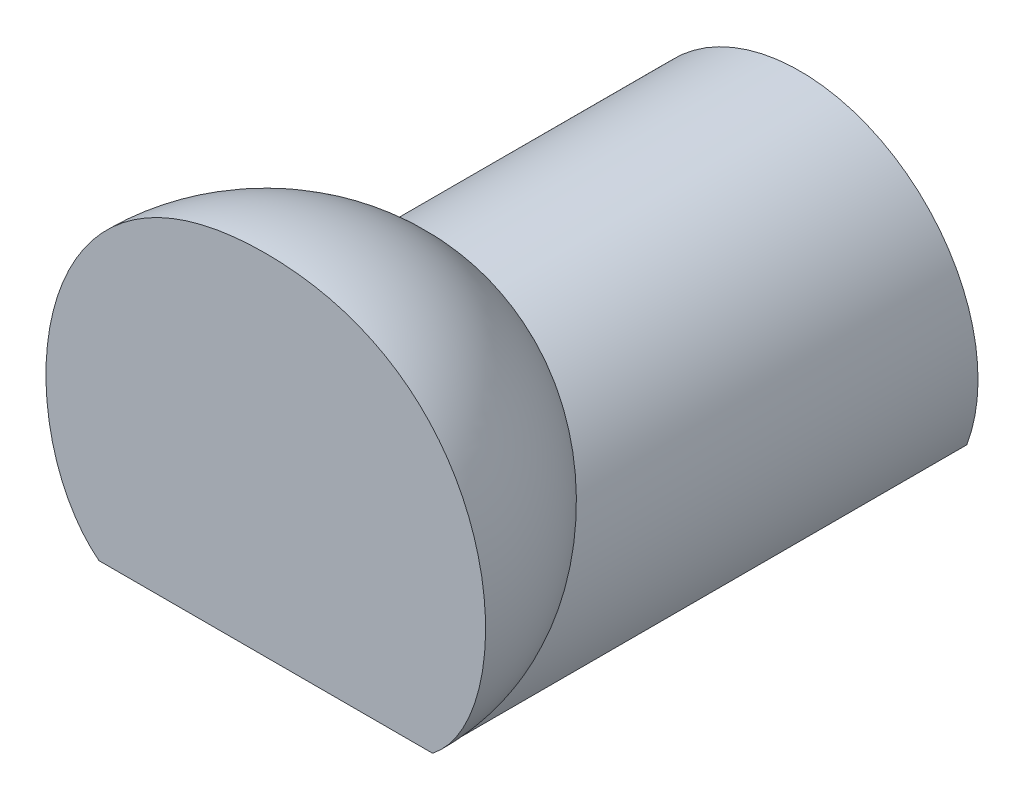
ISO-10303-21;
HEADER;
FILE_DESCRIPTION(('STEP AP214'),'2;1');
FILE_NAME('part.step','',(''),(''),'','','');
FILE_SCHEMA(('AUTOMOTIVE_DESIGN { 1 0 10303 214 1 1 1 1 }'));
ENDSEC;
DATA;
#1=APPLICATION_CONTEXT('core data for automotive mechanical design processes');
#2=APPLICATION_PROTOCOL_DEFINITION('international standard','automotive_design',2000,#1);
#3=PRODUCT_CONTEXT('',#1,'mechanical');
#4=PRODUCT('Part','Part','',(#3));
#5=PRODUCT_RELATED_PRODUCT_CATEGORY('part','',(#4));
#6=PRODUCT_DEFINITION_FORMATION('','',#4);
#7=PRODUCT_DEFINITION_CONTEXT('part definition',#1,'design');
#8=PRODUCT_DEFINITION('design','',#6,#7);
#9=PRODUCT_DEFINITION_SHAPE('','',#8);
#10=(LENGTH_UNIT() NAMED_UNIT(*) SI_UNIT(.MILLI.,.METRE.));
#11=(NAMED_UNIT(*) PLANE_ANGLE_UNIT() SI_UNIT($,.RADIAN.));
#12=(NAMED_UNIT(*) SI_UNIT($,.STERADIAN.) SOLID_ANGLE_UNIT());
#13=UNCERTAINTY_MEASURE_WITH_UNIT(LENGTH_MEASURE(1.E-05),#10,'distance_accuracy_value','');
#14=(GEOMETRIC_REPRESENTATION_CONTEXT(3) GLOBAL_UNCERTAINTY_ASSIGNED_CONTEXT((#13)) GLOBAL_UNIT_ASSIGNED_CONTEXT((#10,
#11,#12)) REPRESENTATION_CONTEXT('',''));
#15=CARTESIAN_POINT('',(0.,0.,0.));
#16=DIRECTION('',(0.,0.,1.));
#17=DIRECTION('',(1.,0.,0.));
#18=AXIS2_PLACEMENT_3D('',#15,#16,#17);
#19=CARTESIAN_POINT('',(18.7349939951952,7.,45.));
#20=DIRECTION('',(0.,0.,-1.));
#21=DIRECTION('',(-1.,0.,0.));
#22=AXIS2_PLACEMENT_3D('',#19,#20,#21);
#23=CYLINDRICAL_SURFACE('',#22,20.);
#24=DIRECTION('',(0.,0.,-1.));
#25=VECTOR('',#24,1.);
#26=CARTESIAN_POINT('',(0.,0.,45.));
#27=LINE('',#26,#25);
#28=CARTESIAN_POINT('',(0.,0.,60.));
#29=VERTEX_POINT('',#28);
#30=CARTESIAN_POINT('',(0.,0.,0.));
#31=VERTEX_POINT('',#30);
#32=EDGE_CURVE('E11',#29,#31,#27,.T.);
#33=ORIENTED_EDGE('',*,*,#32,.F.);
#34=CARTESIAN_POINT('',(0.,0.,60.));
#35=CARTESIAN_POINT('',(-1.49588586913227E-06,2.4836416856962E-05,59.7771956089762));
#36=CARTESIAN_POINT('',(-0.00163058694526144,0.0043651027708911,59.5543833675001));
#37=CARTESIAN_POINT('',(-0.0081644600845192,0.0218786428731389,59.1086065100618));
#38=CARTESIAN_POINT('',(-0.0130772916976982,0.0350736227683761,58.8856428679733));
#39=CARTESIAN_POINT('',(-0.0262080014116734,0.070523990218114,58.4402311770362));
#40=CARTESIAN_POINT('',(-0.0344302631593904,0.092791395522377,58.2177842071907));
#41=CARTESIAN_POINT('',(-0.0541964937516618,0.146741378775225,57.7740883447886));
#42=CARTESIAN_POINT('',(-0.0657417597322178,0.178427633533923,57.5528399545249));
#43=CARTESIAN_POINT('',(-0.0920470270505949,0.251369164046482,57.1138055400158));
#44=CARTESIAN_POINT('',(-0.106782512335607,0.292551612857774,56.8960060047371));
#45=CARTESIAN_POINT('',(-0.139458123780874,0.385057528453657,56.4629421834637));
#46=CARTESIAN_POINT('',(-0.157396315549423,0.436374875870754,56.2476764502809));
#47=CARTESIAN_POINT('',(-0.196353776567661,0.549600478886838,55.8203597749052));
#48=CARTESIAN_POINT('',(-0.217371210156514,0.611502428224116,55.6083069998702));
#49=CARTESIAN_POINT('',(-0.262278514648397,0.746306413373693,55.1880750214285));
#50=CARTESIAN_POINT('',(-0.286167765899213,0.819206077071063,54.9798949935536));
#51=CARTESIAN_POINT('',(-0.333934107764347,0.968295166078048,54.5890687933806));
#52=CARTESIAN_POINT('',(-0.357565768607208,1.04339758973547,54.4059775644469));
#53=CARTESIAN_POINT('',(-0.406563231231058,1.20278184087857,54.0440153128466));
#54=CARTESIAN_POINT('',(-0.43192943844138,1.28706581719086,53.8651452900685));
#55=CARTESIAN_POINT('',(-0.48398591385509,1.46471545423644,53.5121688104094));
#56=CARTESIAN_POINT('',(-0.510676198222776,1.55808122585341,53.338062411723));
#57=CARTESIAN_POINT('',(-0.56490132064884,1.75363642509622,52.9950627389094));
#58=CARTESIAN_POINT('',(-0.592435987906084,1.85582407573154,52.8261684241735));
#59=CARTESIAN_POINT('',(-0.647779227491819,2.06845422175168,52.4941752024019));
#60=CARTESIAN_POINT('',(-0.675587174481598,2.17888053813165,52.3310658187776));
#61=CARTESIAN_POINT('',(-0.730984866062051,2.40766737663284,52.0104664480797));
#62=CARTESIAN_POINT('',(-0.758574599108373,2.5260283154283,51.852976756782));
#63=CARTESIAN_POINT('',(-0.812991412219296,2.77011844999004,51.5436401958467));
#64=CARTESIAN_POINT('',(-0.839818360407673,2.89584890849122,51.3917943005754));
#65=CARTESIAN_POINT('',(-0.892175085296673,3.15401577922707,51.0937063015866));
#66=CARTESIAN_POINT('',(-0.917704886566853,3.28645206435023,50.9474640917413));
#67=CARTESIAN_POINT('',(-0.982949604641426,3.64527928619712,50.5672823608682));
#68=CARTESIAN_POINT('',(-1.02112447655065,3.87689325276355,50.3379869698994));
#69=CARTESIAN_POINT('',(-1.09063338094304,4.35375707411201,49.8929352270546));
#70=CARTESIAN_POINT('',(-1.12196586818991,4.59900999336232,49.6771819412558));
#71=CARTESIAN_POINT('',(-1.17620063876674,5.10053795172373,49.2577431913126));
#72=CARTESIAN_POINT('',(-1.19910187587586,5.35681435431823,49.0540592274612));
#73=CARTESIAN_POINT('',(-1.23530689551196,5.87928971390253,48.6563457211234));
#74=CARTESIAN_POINT('',(-1.24856506972174,6.1455296414584,48.4623660471849));
#75=CARTESIAN_POINT('',(-1.26434021557792,6.68475017710492,48.0836830527569));
#76=CARTESIAN_POINT('',(-1.26685902005899,6.95772962699591,47.8989781547056));
#77=CARTESIAN_POINT('',(-1.26043219644868,7.50880659836465,47.5375168575702));
#78=CARTESIAN_POINT('',(-1.25148509405475,7.7869047734832,47.3607614836723));
#79=CARTESIAN_POINT('',(-1.22148774682848,8.34848353536577,47.0130619780293));
#80=CARTESIAN_POINT('',(-1.20036182610214,8.63198695923915,46.8421613259128));
#81=CARTESIAN_POINT('',(-1.14554042897611,9.20140370247291,46.5064360875355));
#82=CARTESIAN_POINT('',(-1.11184358982335,9.48731727982087,46.3416121621531));
#83=CARTESIAN_POINT('',(-1.03158190781987,10.0604274717449,46.0173320969477));
#84=CARTESIAN_POINT('',(-0.985015420683025,10.347624245652,45.8578766459483));
#85=CARTESIAN_POINT('',(-0.878805520256431,10.9222777452244,45.5438007642434));
#86=CARTESIAN_POINT('',(-0.819160859484604,11.2097344930809,45.3891807963867));
#87=CARTESIAN_POINT('',(-0.686731170459327,11.7836395556042,45.084564065848));
#88=CARTESIAN_POINT('',(-0.613961240409154,12.0700886473849,44.9345622205753));
#89=CARTESIAN_POINT('',(-0.455155351044135,12.6414667037071,44.6387263725461));
#90=CARTESIAN_POINT('',(-0.369118167976433,12.9263955255102,44.4928927557335));
#91=CARTESIAN_POINT('',(-0.091053485007462,13.7776099054765,44.0614135333787));
#92=CARTESIAN_POINT('',(0.120972612100965,14.3405218994061,43.7816850603958));
#93=CARTESIAN_POINT('',(0.598509670671693,15.4518918372759,43.2373863022232));
#94=CARTESIAN_POINT('',(0.864099241223009,16.000327181863,42.9728390384379));
#95=CARTESIAN_POINT('',(1.44798079428062,17.076399692304,42.4598725217441));
#96=CARTESIAN_POINT('',(1.76627452527343,17.604036167426,42.2114538042888));
#97=CARTESIAN_POINT('',(2.45436220569042,18.6328845012869,41.7319813170179));
#98=CARTESIAN_POINT('',(2.82414879478703,19.1341001225008,41.5009250726855));
#99=CARTESIAN_POINT('',(3.6135202696168,20.1046633593275,41.0576820375329));
#100=CARTESIAN_POINT('',(4.03310068442616,20.5740138301311,40.8454935555885));
#101=CARTESIAN_POINT('',(4.88873998633362,21.4439307172462,40.4557247316786));
#102=CARTESIAN_POINT('',(5.32161496773537,21.847011100077,40.2767632349505));
#103=CARTESIAN_POINT('',(6.22582398368043,22.6164334084946,39.9379262067828));
#104=CARTESIAN_POINT('',(6.69715664470536,22.98277664511,39.7780499942131));
#105=CARTESIAN_POINT('',(7.67481864358307,23.6742564306214,39.4786569097011));
#106=CARTESIAN_POINT('',(8.18112907696582,23.9994149735141,39.3391291649204));
#107=CARTESIAN_POINT('',(9.22510176283355,24.6047126562686,39.0813273889217));
#108=CARTESIAN_POINT('',(9.76276125741669,24.8848557481995,38.9630514918195));
#109=CARTESIAN_POINT('',(10.8135296625026,25.372642639015,38.7584990513495));
#110=CARTESIAN_POINT('',(11.3242561767412,25.584610054586,38.6702675053617));
#111=CARTESIAN_POINT('',(12.3640419172193,25.9662224742215,38.5122674456236));
#112=CARTESIAN_POINT('',(12.8930999372077,26.1358702570048,38.4424977196467));
#113=CARTESIAN_POINT('',(13.9653637203266,26.430897190416,38.3216740342182));
#114=CARTESIAN_POINT('',(14.5085659292036,26.5562873493173,38.2706154205991));
#115=CARTESIAN_POINT('',(15.6049433783411,26.7614214012023,38.1873195532683));
#116=CARTESIAN_POINT('',(16.1581183469297,26.8411665356879,38.1550817876468));
#117=CARTESIAN_POINT('',(17.2394610003394,26.9509987886085,38.1107353346303));
#118=CARTESIAN_POINT('',(17.7673369856665,26.9835687127975,38.0976199696033));
#119=CARTESIAN_POINT('',(18.8241449449622,27.0067829623924,38.0882687489883));
#120=CARTESIAN_POINT('',(19.353076870685,26.9974291613601,38.0920321390926));
#121=CARTESIAN_POINT('',(20.4080714692925,26.9368992323341,38.1164313089231));
#122=CARTESIAN_POINT('',(20.9341345382521,26.8857290326297,38.1370646969985));
#123=CARTESIAN_POINT('',(21.9796530064015,26.7421026821257,38.1951725898335));
#124=CARTESIAN_POINT('',(22.4991083851378,26.6496464035614,38.2326471467101));
#125=CARTESIAN_POINT('',(23.5214903661001,26.4257562873375,38.3238149618088));
#126=CARTESIAN_POINT('',(24.0245406372475,26.294804768815,38.3773076696024));
#127=CARTESIAN_POINT('',(25.0171058418551,25.9948376925695,38.5005294052069));
#128=CARTESIAN_POINT('',(25.5066209836118,25.8258227209838,38.5702581829998));
#129=CARTESIAN_POINT('',(26.4688771456133,25.4513844653394,38.725727139777));
#130=CARTESIAN_POINT('',(26.9416183831949,25.2459616532181,38.8114671112166));
#131=CARTESIAN_POINT('',(27.8673545346471,24.8006692807009,38.9986213659949));
#132=CARTESIAN_POINT('',(28.3203490824409,24.5607990820509,39.1000359397613));
#133=CARTESIAN_POINT('',(29.2129207567741,24.0436056954238,39.320302525665));
#134=CARTESIAN_POINT('',(29.6520351824387,23.7656178857221,39.4394682516103));
#135=CARTESIAN_POINT('',(30.5043838914937,23.1786660599343,39.6930109910996));
#136=CARTESIAN_POINT('',(30.9176179617617,22.8697017888142,39.8273881298826));
#137=CARTESIAN_POINT('',(31.7161305529493,22.2234671761465,40.1106351996335));
#138=CARTESIAN_POINT('',(32.1014043781745,21.8861921004484,40.259507555169));
#139=CARTESIAN_POINT('',(32.8421454518807,21.1861899802146,40.5709013117398));
#140=CARTESIAN_POINT('',(33.1976116986799,20.8234620810902,40.7334231710987));
#141=CARTESIAN_POINT('',(33.8974469855357,20.053220780794,41.0812684224622));
#142=CARTESIAN_POINT('',(34.2399092859191,19.644327172322,41.2673723514584));
#143=CARTESIAN_POINT('',(34.8884329333807,18.8045707071139,41.6529137295126));
#144=CARTESIAN_POINT('',(35.1944929785826,18.373707065437,41.8523516550442));
#145=CARTESIAN_POINT('',(35.7692786697992,17.4933104788149,42.2636895821026));
#146=CARTESIAN_POINT('',(36.0379968635685,17.0437738305163,42.4755920591819));
#147=CARTESIAN_POINT('',(36.5373436631041,16.1294946259526,42.9111144333635));
#148=CARTESIAN_POINT('',(36.7679712000462,15.6647516434358,43.1347346590341));
#149=CARTESIAN_POINT('',(37.2094112945778,14.6818756816132,43.6135705752202));
#150=CARTESIAN_POINT('',(37.4166690870463,14.1626552009385,43.8698316973332));
#151=CARTESIAN_POINT('',(37.7853941754178,13.1147879126686,44.3959084577075));
#152=CARTESIAN_POINT('',(37.9468567581003,12.5861401407681,44.6657254877748));
#153=CARTESIAN_POINT('',(38.1549070861842,11.7898286452901,45.0814511038455));
#154=CARTESIAN_POINT('',(38.2185928455235,11.523683949431,45.221941913817));
#155=CARTESIAN_POINT('',(38.3346358781269,10.991026485616,45.5068357362875));
#156=CARTESIAN_POINT('',(38.3869940452112,10.7245137483722,45.6512384391003));
#157=CARTESIAN_POINT('',(38.4804995483676,10.1918835975176,45.9442852466584));
#158=CARTESIAN_POINT('',(38.5216476870189,9.92576615696298,46.0929290469212));
#159=CARTESIAN_POINT('',(38.5929128545227,9.3947476563674,46.3949116443904));
#160=CARTESIAN_POINT('',(38.6230307114629,9.12984650648957,46.5482500882141));
#161=CARTESIAN_POINT('',(38.67579268848,8.5667904690666,46.8811122073973));
#162=CARTESIAN_POINT('',(38.6968946880232,8.26893576593516,47.0613915087187));
#163=CARTESIAN_POINT('',(38.7257091777583,7.67746725354671,47.4297865842732));
#164=CARTESIAN_POINT('',(38.7334222651811,7.38385325570664,47.6179020085821));
#165=CARTESIAN_POINT('',(38.7361314196595,6.80254484724997,48.0033310293957));
#166=CARTESIAN_POINT('',(38.7311243663283,6.51485190658411,48.200646871206));
#167=CARTESIAN_POINT('',(38.7093236355508,5.94816177627246,48.6055412961968));
#168=CARTESIAN_POINT('',(38.6925557781677,5.66914693322583,48.8130964733232));
#169=CARTESIAN_POINT('',(38.6484880348933,5.121661955098,49.2405539896344));
#170=CARTESIAN_POINT('',(38.6211903281111,4.85318965093891,49.4604537661149));
#171=CARTESIAN_POINT('',(38.5576792371779,4.32968214616587,49.914383597373));
#172=CARTESIAN_POINT('',(38.5214697010538,4.07464120359019,50.1484075206729));
#173=CARTESIAN_POINT('',(38.4551668949897,3.66186713238764,50.5531590214252));
#174=CARTESIAN_POINT('',(38.4269448025525,3.49958303855771,50.7195638963224));
#175=CARTESIAN_POINT('',(38.3681520274668,3.18359970559999,51.0599315445946));
#176=CARTESIAN_POINT('',(38.3375816011015,3.02989953282656,51.2338934923374));
#177=CARTESIAN_POINT('',(38.2749155243256,2.73214085252088,51.5896191913966));
#178=CARTESIAN_POINT('',(38.2428199535417,2.588081842573,51.7713825353588));
#179=CARTESIAN_POINT('',(38.1780605141856,2.31093055648939,52.142314789076));
#180=CARTESIAN_POINT('',(38.1453981897804,2.17781285568955,52.3314649314476));
#181=CARTESIAN_POINT('',(38.0803170264205,1.92301509812355,52.7173898292261));
#182=CARTESIAN_POINT('',(38.0478982075125,1.80133597374893,52.9141652043447));
#183=CARTESIAN_POINT('',(37.9841626532783,1.57009234723161,53.3148641715499));
#184=CARTESIAN_POINT('',(37.952845789891,1.46052643419125,53.5187869274868));
#185=CARTESIAN_POINT('',(37.8996201060585,1.27954003032062,53.8816765376593));
#186=CARTESIAN_POINT('',(37.8773058470729,1.20540256587046,54.0392353171779));
#187=CARTESIAN_POINT('',(37.8339999417238,1.06422604013583,54.3576841880912));
#188=CARTESIAN_POINT('',(37.8130083921636,0.997187498146855,54.5185745221657));
#189=CARTESIAN_POINT('',(37.7523768301285,0.806696390388244,55.005703850501));
#190=CARTESIAN_POINT('',(37.7150731306037,0.693845798165489,55.3364465790425));
#191=CARTESIAN_POINT('',(37.6478720271702,0.495073172617866,56.0077095917765));
#192=CARTESIAN_POINT('',(37.6179989577775,0.409239379063229,56.3482580298408));
#193=CARTESIAN_POINT('',(37.5663624672729,0.263118802890487,57.0353270170418));
#194=CARTESIAN_POINT('',(37.5445978113487,0.202828130175027,57.3818466484224));
#195=CARTESIAN_POINT('',(37.5174066332155,0.128194733800274,57.9185678172831));
#196=CARTESIAN_POINT('',(37.5090663340194,0.105464070201562,58.1075130618162));
#197=CARTESIAN_POINT('',(37.4947888354114,0.0667083859631935,58.4861438699941));
#198=CARTESIAN_POINT('',(37.4888510654715,0.0506817732835771,58.6758292470647));
#199=CARTESIAN_POINT('',(37.4793989902357,0.0252260838941812,59.0544629199815));
#200=CARTESIAN_POINT('',(37.4758692465961,0.015754972714439,59.2434080391536));
#201=CARTESIAN_POINT('',(37.4711640532883,0.00314797240771398,59.6215693758854));
#202=CARTESIAN_POINT('',(37.4699889768744,1.30876783628889E-05,59.8107856316685));
#203=CARTESIAN_POINT('',(37.4699879903904,0.,60.));
#204=B_SPLINE_CURVE_WITH_KNOTS('',3,(#34,#35,#36,#37,#38,#39,#40,#41,#42,#43,#44,#45,#46,#47,
#48,#49,#50,#51,#52,#53,#54,#55,#56,#57,#58,#59,#60,#61,#62,#63,#64,#65,#66,#67,#68,#69,#70,#71,
#72,#73,#74,#75,#76,#77,#78,#79,#80,#81,#82,#83,#84,#85,#86,#87,#88,#89,#90,#91,#92,#93,#94,#95,
#96,#97,#98,#99,#100,#101,#102,#103,#104,#105,#106,#107,#108,#109,#110,#111,#112,#113,#114,#115,
#116,#117,#118,#119,#120,#121,#122,#123,#124,#125,#126,#127,#128,#129,#130,#131,#132,#133,#134,
#135,#136,#137,#138,#139,#140,#141,#142,#143,#144,#145,#146,#147,#148,#149,#150,#151,#152,#153,
#154,#155,#156,#157,#158,#159,#160,#161,#162,#163,#164,#165,#166,#167,#168,#169,#170,#171,#172,
#173,#174,#175,#176,#177,#178,#179,#180,#181,#182,#183,#184,#185,#186,#187,#188,#189,#190,#191,
#192,#193,#194,#195,#196,#197,#198,#199,#200,#201,#202,#203),.UNSPECIFIED.,.F.,.F.,(4,2,2,2,2,2,
2,2,2,2,2,2,2,2,2,2,2,2,2,2,2,2,2,2,2,2,2,2,2,2,2,2,2,2,2,2,2,2,2,2,2,2,2,2,2,2,2,2,2,2,2,2,2,2,
2,2,2,2,2,2,2,2,2,2,2,2,2,2,2,2,2,2,2,2,2,2,2,2,2,2,2,2,2,2,4),(0.,0.668377730523568,
1.33839991408078,2.00931254030489,2.68048741354191,3.34667680251591,4.01246517489619,
4.67785824676828,5.34310800357951,5.94075917213442,6.5385505151372,7.13634915775666,
7.73402766554439,8.33056187945453,8.92712744399837,9.52379552796125,10.1204523060812,
11.1041190746101,12.0880077583603,13.072018490223,14.0606535101929,15.0491197979993,
16.0377131969533,17.0325166953822,18.0274280670458,19.0224666120281,20.0176001116422,
21.0115961106653,22.0056838493914,23.9931748166955,25.9836041088407,27.9740994476941,
29.9643105590221,31.9543431068541,33.8057501252772,35.6570910495048,37.5074390897584,
39.3576245924137,41.03536617303,42.712997563656,44.3902113796512,46.0673795748296,
47.6525969661414,49.2377435151535,50.8226653777291,52.4075921450676,53.9734507529741,
55.5392852499469,57.1050994512398,58.6709426682719,60.2687520188759,61.866574525568,
63.4646647554553,65.0628086675566,66.7556829495919,68.4486177567331,70.1418899360724,
71.8352096205829,73.6782430282481,75.5214660512354,76.4441178093999,77.3666967378102,
78.2892095970263,79.2116531852685,80.257694930866,81.3036900151461,82.34994171801,
83.3939036055535,84.437649565272,85.4809456355631,86.1831226767635,86.8852231950744,
87.5872870973257,88.2876705359802,88.988111015507,89.6884698244269,90.2149519569434,
90.7414725757516,91.7943609323853,92.8506532843967,93.9067847101654,94.478144006929,
95.0493675433963,95.6168935382589,96.1845094884094),.UNSPECIFIED.);
#205=CARTESIAN_POINT('',(37.4699879903904,0.,60.));
#206=VERTEX_POINT('',#205);
#207=EDGE_CURVE('E73',#29,#206,#204,.T.);
#208=ORIENTED_EDGE('',*,*,#207,.T.);
#209=DIRECTION('',(0.,0.,-1.));
#210=VECTOR('',#209,1.);
#211=CARTESIAN_POINT('',(37.4699879903904,0.,45.));
#212=LINE('',#211,#210);
#213=CARTESIAN_POINT('',(37.4699879903904,0.,0.));
#214=VERTEX_POINT('',#213);
#215=EDGE_CURVE('E48',#206,#214,#212,.T.);
#216=ORIENTED_EDGE('',*,*,#215,.T.);
#217=CARTESIAN_POINT('',(18.7349939951952,7.,0.));
#218=DIRECTION('',(0.,0.,1.));
#219=DIRECTION('',(-1.,0.,0.));
#220=AXIS2_PLACEMENT_3D('',#217,#218,#219);
#221=CIRCLE('',#220,20.);
#222=EDGE_CURVE('E90',#214,#31,#221,.T.);
#223=ORIENTED_EDGE('',*,*,#222,.T.);
#224=EDGE_LOOP('',(#33,#208,#216,#223));
#225=FACE_BOUND('',#224,.T.);
#226=ADVANCED_FACE('F39',(#225),#23,.T.);
#227=CARTESIAN_POINT('',(0.,0.,45.));
#228=DIRECTION('',(0.,1.,0.));
#229=DIRECTION('',(0.,0.,1.));
#230=AXIS2_PLACEMENT_3D('',#227,#228,#229);
#231=PLANE('',#230);
#232=ORIENTED_EDGE('',*,*,#215,.F.);
#233=DIRECTION('',(1.,0.,0.));
#234=VECTOR('',#233,1.);
#235=CARTESIAN_POINT('',(0.,0.,60.));
#236=LINE('',#235,#234);
#237=EDGE_CURVE('E84',#29,#206,#236,.T.);
#238=ORIENTED_EDGE('',*,*,#237,.F.);
#239=ORIENTED_EDGE('',*,*,#32,.T.);
#240=DIRECTION('',(1.,0.,0.));
#241=VECTOR('',#240,1.);
#242=CARTESIAN_POINT('',(0.,0.,0.));
#243=LINE('',#242,#241);
#244=EDGE_CURVE('E54',#31,#214,#243,.T.);
#245=ORIENTED_EDGE('',*,*,#244,.T.);
#246=EDGE_LOOP('',(#232,#238,#239,#245));
#247=FACE_BOUND('',#246,.T.);
#248=ADVANCED_FACE('F86',(#247),#231,.F.);
#249=CARTESIAN_POINT('',(18.7349939951952,7.,0.));
#250=DIRECTION('',(0.,0.,-1.));
#251=DIRECTION('',(-1.,0.,0.));
#252=AXIS2_PLACEMENT_3D('',#249,#250,#251);
#253=PLANE('',#252);
#254=ORIENTED_EDGE('',*,*,#222,.F.);
#255=ORIENTED_EDGE('',*,*,#244,.F.);
#256=EDGE_LOOP('',(#254,#255));
#257=FACE_BOUND('',#256,.T.);
#258=ADVANCED_FACE('F110',(#257),#253,.T.);
#259=CARTESIAN_POINT('',(18.7349939951952,7.,60.));
#260=DIRECTION('',(0.,0.,1.));
#261=DIRECTION('',(1.,0.,0.));
#262=AXIS2_PLACEMENT_3D('',#259,#260,#261);
#263=PLANE('',#262);
#264=ORIENTED_EDGE('',*,*,#237,.T.);
#265=CARTESIAN_POINT('',(37.4699879903904,0.,60.));
#266=CARTESIAN_POINT('',(48.0093621475589,8.20610143645952,60.));
#267=CARTESIAN_POINT('',(46.1787878635775,39.2325866681197,60.));
#268=CARTESIAN_POINT('',(18.7349939951952,39.2594362338952,60.));
#269=B_SPLINE_CURVE_WITH_KNOTS('',3,(#265,#266,#267,#268),.UNSPECIFIED.,.F.,.F.,(4,4),(0.,1.),.UNSPECIFIED.);
#270=CARTESIAN_POINT('',(18.7349939951952,39.2594362338952,60.));
#271=VERTEX_POINT('',#270);
#272=EDGE_CURVE('E70',#206,#271,#269,.T.);
#273=ORIENTED_EDGE('',*,*,#272,.T.);
#274=CARTESIAN_POINT('',(0.,0.,60.0000000000001));
#275=CARTESIAN_POINT('',(-10.5393741571685,8.20610143645952,60.0000000000002));
#276=CARTESIAN_POINT('',(-8.70879987318712,39.2325866681197,60.0000000000002));
#277=CARTESIAN_POINT('',(18.7349939951952,39.2594362338952,60.));
#278=B_SPLINE_CURVE_WITH_KNOTS('',3,(#274,#275,#276,#277),.UNSPECIFIED.,.F.,.F.,(4,4),(0.,1.),.UNSPECIFIED.);
#279=EDGE_CURVE('E75',#29,#271,#278,.T.);
#280=ORIENTED_EDGE('',*,*,#279,.F.);
#281=EDGE_LOOP('',(#264,#273,#280));
#282=FACE_BOUND('',#281,.T.);
#283=ADVANCED_FACE('F88',(#282),#263,.T.);
#284=CARTESIAN_POINT('',(18.7349939951952,0.,60.));
#285=DIRECTION('',(0.,-1.,0.));
#286=AXIS1_PLACEMENT('',#284,#285);
#287=SURFACE_OF_REVOLUTION('',#278,#286);
#288=ORIENTED_EDGE('',*,*,#207,.F.);
#289=ORIENTED_EDGE('',*,*,#279,.T.);
#290=ORIENTED_EDGE('',*,*,#272,.F.);
#291=EDGE_LOOP('',(#288,#289,#290));
#292=FACE_BOUND('',#291,.T.);
#293=ADVANCED_FACE('F72',(#292),#287,.F.);
#294=CLOSED_SHELL('',(#226,#248,#258,#283,#293));
#295=MANIFOLD_SOLID_BREP('B2',#294);
#296=ADVANCED_BREP_SHAPE_REPRESENTATION('',(#18,#295),#14);
#297=SHAPE_DEFINITION_REPRESENTATION(#9,#296);
ENDSEC;
END-ISO-10303-21;
